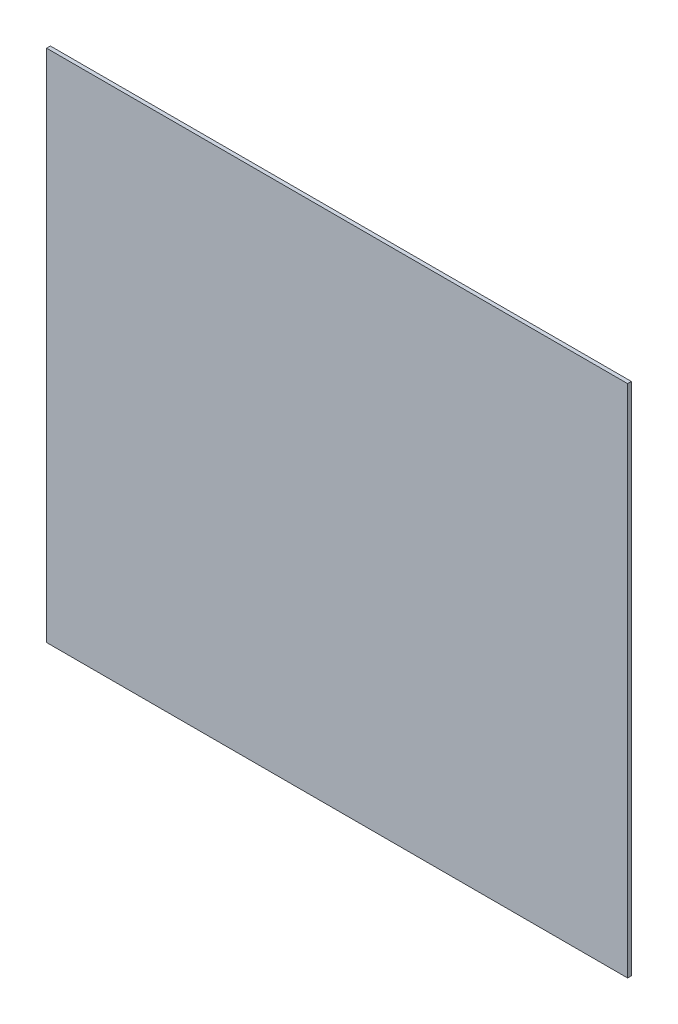
ISO-10303-21;
HEADER;
FILE_DESCRIPTION(('STEP AP214'),'2;1');
FILE_NAME('part.step','',(''),(''),'','','');
FILE_SCHEMA(('AUTOMOTIVE_DESIGN { 1 0 10303 214 1 1 1 1 }'));
ENDSEC;
DATA;
#1=APPLICATION_CONTEXT('core data for automotive mechanical design processes');
#2=APPLICATION_PROTOCOL_DEFINITION('international standard','automotive_design',2000,#1);
#3=PRODUCT_CONTEXT('',#1,'mechanical');
#4=PRODUCT('Part','Part','',(#3));
#5=PRODUCT_RELATED_PRODUCT_CATEGORY('part','',(#4));
#6=PRODUCT_DEFINITION_FORMATION('','',#4);
#7=PRODUCT_DEFINITION_CONTEXT('part definition',#1,'design');
#8=PRODUCT_DEFINITION('design','',#6,#7);
#9=PRODUCT_DEFINITION_SHAPE('','',#8);
#10=(LENGTH_UNIT() NAMED_UNIT(*) SI_UNIT(.MILLI.,.METRE.));
#11=(NAMED_UNIT(*) PLANE_ANGLE_UNIT() SI_UNIT($,.RADIAN.));
#12=(NAMED_UNIT(*) SI_UNIT($,.STERADIAN.) SOLID_ANGLE_UNIT());
#13=UNCERTAINTY_MEASURE_WITH_UNIT(LENGTH_MEASURE(1.E-05),#10,'distance_accuracy_value','');
#14=(GEOMETRIC_REPRESENTATION_CONTEXT(3) GLOBAL_UNCERTAINTY_ASSIGNED_CONTEXT((#13)) GLOBAL_UNIT_ASSIGNED_CONTEXT((#10,
#11,#12)) REPRESENTATION_CONTEXT('',''));
#15=CARTESIAN_POINT('',(0.,0.,0.));
#16=DIRECTION('',(0.,0.,1.));
#17=DIRECTION('',(1.,0.,0.));
#18=AXIS2_PLACEMENT_3D('',#15,#16,#17);
#19=CARTESIAN_POINT('',(0.,0.,6.35));
#20=DIRECTION('',(0.,0.,1.));
#21=DIRECTION('',(1.,0.,0.));
#22=AXIS2_PLACEMENT_3D('',#19,#20,#21);
#23=PLANE('',#22);
#24=DIRECTION('',(1.,0.,0.));
#25=VECTOR('',#24,1.);
#26=CARTESIAN_POINT('',(974.725,863.6,6.35));
#27=LINE('',#26,#25);
#28=CARTESIAN_POINT('',(0.,863.6,6.35));
#29=VERTEX_POINT('',#28);
#30=CARTESIAN_POINT('',(974.725,863.6,6.35));
#31=VERTEX_POINT('',#30);
#32=EDGE_CURVE('E79',#29,#31,#27,.T.);
#33=ORIENTED_EDGE('',*,*,#32,.F.);
#34=DIRECTION('',(0.,1.,0.));
#35=VECTOR('',#34,1.);
#36=CARTESIAN_POINT('',(0.,863.6,6.35));
#37=LINE('',#36,#35);
#38=CARTESIAN_POINT('',(0.,0.,6.35));
#39=VERTEX_POINT('',#38);
#40=EDGE_CURVE('E81',#39,#29,#37,.T.);
#41=ORIENTED_EDGE('',*,*,#40,.F.);
#42=DIRECTION('',(1.,0.,0.));
#43=VECTOR('',#42,1.);
#44=CARTESIAN_POINT('',(0.,0.,6.35));
#45=LINE('',#44,#43);
#46=CARTESIAN_POINT('',(974.725,0.,6.35));
#47=VERTEX_POINT('',#46);
#48=EDGE_CURVE('E74',#47,#39,#45,.F.);
#49=ORIENTED_EDGE('',*,*,#48,.F.);
#50=DIRECTION('',(0.,1.,0.));
#51=VECTOR('',#50,1.);
#52=CARTESIAN_POINT('',(974.725,0.,6.35));
#53=LINE('',#52,#51);
#54=EDGE_CURVE('E83',#31,#47,#53,.F.);
#55=ORIENTED_EDGE('',*,*,#54,.F.);
#56=EDGE_LOOP('',(#33,#41,#49,#55));
#57=FACE_BOUND('',#56,.T.);
#58=ADVANCED_FACE('F35',(#57),#23,.T.);
#59=CARTESIAN_POINT('',(0.,863.6,0.));
#60=DIRECTION('',(-1.,0.,0.));
#61=DIRECTION('',(0.,0.,1.));
#62=AXIS2_PLACEMENT_3D('',#59,#60,#61);
#63=PLANE('',#62);
#64=ORIENTED_EDGE('',*,*,#40,.T.);
#65=DIRECTION('',(0.,0.,1.));
#66=VECTOR('',#65,1.);
#67=CARTESIAN_POINT('',(0.,863.6,0.));
#68=LINE('',#67,#66);
#69=CARTESIAN_POINT('',(0.,863.6,0.));
#70=VERTEX_POINT('',#69);
#71=EDGE_CURVE('E92',#29,#70,#68,.F.);
#72=ORIENTED_EDGE('',*,*,#71,.T.);
#73=DIRECTION('',(0.,1.,0.));
#74=VECTOR('',#73,1.);
#75=CARTESIAN_POINT('',(0.,0.,0.));
#76=LINE('',#75,#74);
#77=CARTESIAN_POINT('',(0.,0.,0.));
#78=VERTEX_POINT('',#77);
#79=EDGE_CURVE('E104',#70,#78,#76,.F.);
#80=ORIENTED_EDGE('',*,*,#79,.T.);
#81=DIRECTION('',(0.,0.,-1.));
#82=VECTOR('',#81,1.);
#83=CARTESIAN_POINT('',(0.,0.,0.));
#84=LINE('',#83,#82);
#85=EDGE_CURVE('E93',#39,#78,#84,.T.);
#86=ORIENTED_EDGE('',*,*,#85,.F.);
#87=EDGE_LOOP('',(#64,#72,#80,#86));
#88=FACE_BOUND('',#87,.T.);
#89=ADVANCED_FACE('F90',(#88),#63,.T.);
#90=CARTESIAN_POINT('',(0.,0.,0.));
#91=DIRECTION('',(0.,-1.,0.));
#92=DIRECTION('',(0.,0.,-1.));
#93=AXIS2_PLACEMENT_3D('',#90,#91,#92);
#94=PLANE('',#93);
#95=ORIENTED_EDGE('',*,*,#48,.T.);
#96=ORIENTED_EDGE('',*,*,#85,.T.);
#97=DIRECTION('',(1.,0.,0.));
#98=VECTOR('',#97,1.);
#99=CARTESIAN_POINT('',(0.,0.,0.));
#100=LINE('',#99,#98);
#101=CARTESIAN_POINT('',(974.725,0.,0.));
#102=VERTEX_POINT('',#101);
#103=EDGE_CURVE('E44',#78,#102,#100,.T.);
#104=ORIENTED_EDGE('',*,*,#103,.T.);
#105=DIRECTION('',(0.,0.,-1.));
#106=VECTOR('',#105,1.);
#107=CARTESIAN_POINT('',(974.725,0.,0.));
#108=LINE('',#107,#106);
#109=EDGE_CURVE('E110',#47,#102,#108,.T.);
#110=ORIENTED_EDGE('',*,*,#109,.F.);
#111=EDGE_LOOP('',(#95,#96,#104,#110));
#112=FACE_BOUND('',#111,.T.);
#113=ADVANCED_FACE('F142',(#112),#94,.T.);
#114=CARTESIAN_POINT('',(974.725,0.,0.));
#115=DIRECTION('',(1.,0.,0.));
#116=DIRECTION('',(0.,0.,-1.));
#117=AXIS2_PLACEMENT_3D('',#114,#115,#116);
#118=PLANE('',#117);
#119=ORIENTED_EDGE('',*,*,#54,.T.);
#120=ORIENTED_EDGE('',*,*,#109,.T.);
#121=DIRECTION('',(0.,1.,0.));
#122=VECTOR('',#121,1.);
#123=CARTESIAN_POINT('',(974.725,0.,0.));
#124=LINE('',#123,#122);
#125=CARTESIAN_POINT('',(974.725,863.6,0.));
#126=VERTEX_POINT('',#125);
#127=EDGE_CURVE('E11',#102,#126,#124,.T.);
#128=ORIENTED_EDGE('',*,*,#127,.T.);
#129=DIRECTION('',(0.,0.,1.));
#130=VECTOR('',#129,1.);
#131=CARTESIAN_POINT('',(974.725,863.6,0.));
#132=LINE('',#131,#130);
#133=EDGE_CURVE('E87',#31,#126,#132,.F.);
#134=ORIENTED_EDGE('',*,*,#133,.F.);
#135=EDGE_LOOP('',(#119,#120,#128,#134));
#136=FACE_BOUND('',#135,.T.);
#137=ADVANCED_FACE('F131',(#136),#118,.T.);
#138=CARTESIAN_POINT('',(974.725,863.6,0.));
#139=DIRECTION('',(0.,1.,0.));
#140=DIRECTION('',(0.,0.,1.));
#141=AXIS2_PLACEMENT_3D('',#138,#139,#140);
#142=PLANE('',#141);
#143=ORIENTED_EDGE('',*,*,#32,.T.);
#144=ORIENTED_EDGE('',*,*,#133,.T.);
#145=DIRECTION('',(1.,0.,0.));
#146=VECTOR('',#145,1.);
#147=CARTESIAN_POINT('',(0.,863.6,0.));
#148=LINE('',#147,#146);
#149=EDGE_CURVE('E53',#126,#70,#148,.F.);
#150=ORIENTED_EDGE('',*,*,#149,.T.);
#151=ORIENTED_EDGE('',*,*,#71,.F.);
#152=EDGE_LOOP('',(#143,#144,#150,#151));
#153=FACE_BOUND('',#152,.T.);
#154=ADVANCED_FACE('F94',(#153),#142,.T.);
#155=CARTESIAN_POINT('',(0.,0.,0.));
#156=DIRECTION('',(0.,0.,1.));
#157=DIRECTION('',(1.,0.,0.));
#158=AXIS2_PLACEMENT_3D('',#155,#156,#157);
#159=PLANE('',#158);
#160=ORIENTED_EDGE('',*,*,#149,.F.);
#161=ORIENTED_EDGE('',*,*,#127,.F.);
#162=ORIENTED_EDGE('',*,*,#103,.F.);
#163=ORIENTED_EDGE('',*,*,#79,.F.);
#164=EDGE_LOOP('',(#160,#161,#162,#163));
#165=FACE_BOUND('',#164,.T.);
#166=ADVANCED_FACE('F132',(#165),#159,.F.);
#167=CLOSED_SHELL('',(#58,#89,#113,#137,#154,#166));
#168=MANIFOLD_SOLID_BREP('B2',#167);
#169=ADVANCED_BREP_SHAPE_REPRESENTATION('',(#18,#168),#14);
#170=SHAPE_DEFINITION_REPRESENTATION(#9,#169);
ENDSEC;
END-ISO-10303-21;
